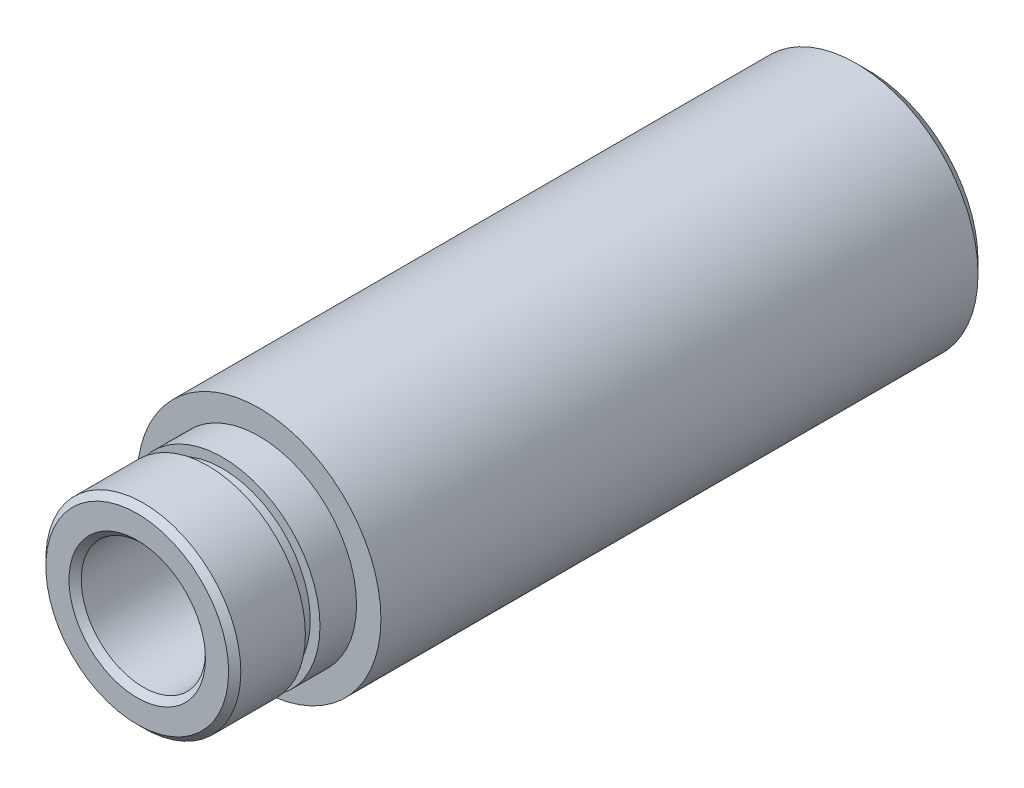
ISO-10303-21;
HEADER;
FILE_DESCRIPTION(('STEP AP214'),'2;1');
FILE_NAME('part.step','',(''),(''),'','','');
FILE_SCHEMA(('AUTOMOTIVE_DESIGN { 1 0 10303 214 1 1 1 1 }'));
ENDSEC;
DATA;
#1=APPLICATION_CONTEXT('core data for automotive mechanical design processes');
#2=APPLICATION_PROTOCOL_DEFINITION('international standard','automotive_design',2000,#1);
#3=PRODUCT_CONTEXT('',#1,'mechanical');
#4=PRODUCT('Part','Part','',(#3));
#5=PRODUCT_RELATED_PRODUCT_CATEGORY('part','',(#4));
#6=PRODUCT_DEFINITION_FORMATION('','',#4);
#7=PRODUCT_DEFINITION_CONTEXT('part definition',#1,'design');
#8=PRODUCT_DEFINITION('design','',#6,#7);
#9=PRODUCT_DEFINITION_SHAPE('','',#8);
#10=(LENGTH_UNIT() NAMED_UNIT(*) SI_UNIT(.MILLI.,.METRE.));
#11=(NAMED_UNIT(*) PLANE_ANGLE_UNIT() SI_UNIT($,.RADIAN.));
#12=(NAMED_UNIT(*) SI_UNIT($,.STERADIAN.) SOLID_ANGLE_UNIT());
#13=UNCERTAINTY_MEASURE_WITH_UNIT(LENGTH_MEASURE(1.E-05),#10,'distance_accuracy_value','');
#14=(GEOMETRIC_REPRESENTATION_CONTEXT(3) GLOBAL_UNCERTAINTY_ASSIGNED_CONTEXT((#13)) GLOBAL_UNIT_ASSIGNED_CONTEXT((#10,
#11,#12)) REPRESENTATION_CONTEXT('',''));
#15=CARTESIAN_POINT('',(0.,0.,0.));
#16=DIRECTION('',(0.,0.,1.));
#17=DIRECTION('',(1.,0.,0.));
#18=AXIS2_PLACEMENT_3D('',#15,#16,#17);
#19=CARTESIAN_POINT('',(0.,0.,20.));
#20=DIRECTION('',(0.,0.,1.));
#21=DIRECTION('',(1.,0.,0.));
#22=AXIS2_PLACEMENT_3D('',#19,#20,#21);
#23=CYLINDRICAL_SURFACE('',#22,8.);
#24=CARTESIAN_POINT('',(0.,0.,29.5));
#25=DIRECTION('',(0.,0.,1.));
#26=DIRECTION('',(1.,0.,0.));
#27=AXIS2_PLACEMENT_3D('',#24,#25,#26);
#28=CIRCLE('',#27,8.);
#29=CARTESIAN_POINT('',(8.,0.,29.5));
#30=VERTEX_POINT('',#29);
#31=EDGE_CURVE('E57',#30,#30,#28,.F.);
#32=ORIENTED_EDGE('',*,*,#31,.T.);
#33=EDGE_LOOP('',(#32));
#34=FACE_BOUND('',#33,.T.);
#35=CARTESIAN_POINT('',(0.,0.,24.2));
#36=DIRECTION('',(0.,0.,-1.));
#37=DIRECTION('',(-1.,0.,0.));
#38=AXIS2_PLACEMENT_3D('',#35,#36,#37);
#39=CIRCLE('',#38,8.);
#40=CARTESIAN_POINT('',(-8.,0.,24.2));
#41=VERTEX_POINT('',#40);
#42=EDGE_CURVE('E64',#41,#41,#39,.F.);
#43=ORIENTED_EDGE('',*,*,#42,.T.);
#44=EDGE_LOOP('',(#43));
#45=FACE_BOUND('',#44,.T.);
#46=ADVANCED_FACE('F46',(#34,#45),#23,.T.);
#47=CARTESIAN_POINT('',(0.,0.,20.));
#48=DIRECTION('',(0.,0.,1.));
#49=DIRECTION('',(1.,0.,0.));
#50=AXIS2_PLACEMENT_3D('',#47,#48,#49);
#51=CIRCLE('',#50,8.);
#52=CARTESIAN_POINT('',(8.,0.,20.));
#53=VERTEX_POINT('',#52);
#54=EDGE_CURVE('E67',#53,#53,#51,.T.);
#55=ORIENTED_EDGE('',*,*,#54,.T.);
#56=EDGE_LOOP('',(#55));
#57=FACE_BOUND('',#56,.T.);
#58=CARTESIAN_POINT('',(0.,0.,23.));
#59=DIRECTION('',(0.,0.,1.));
#60=DIRECTION('',(1.,0.,0.));
#61=AXIS2_PLACEMENT_3D('',#58,#59,#60);
#62=CIRCLE('',#61,8.);
#63=CARTESIAN_POINT('',(8.,0.,23.));
#64=VERTEX_POINT('',#63);
#65=EDGE_CURVE('E68',#64,#64,#62,.F.);
#66=ORIENTED_EDGE('',*,*,#65,.T.);
#67=EDGE_LOOP('',(#66));
#68=FACE_BOUND('',#67,.T.);
#69=ADVANCED_FACE('F114',(#57,#68),#23,.T.);
#70=CARTESIAN_POINT('',(0.,0.,30.));
#71=DIRECTION('',(0.,0.,1.));
#72=DIRECTION('',(1.,0.,0.));
#73=AXIS2_PLACEMENT_3D('',#70,#71,#72);
#74=PLANE('',#73);
#75=CARTESIAN_POINT('',(0.,0.,30.));
#76=DIRECTION('',(0.,0.,1.));
#77=DIRECTION('',(1.,0.,0.));
#78=AXIS2_PLACEMENT_3D('',#75,#76,#77);
#79=CIRCLE('',#78,5.60000000000001);
#80=CARTESIAN_POINT('',(5.60000000000001,0.,30.));
#81=VERTEX_POINT('',#80);
#82=EDGE_CURVE('E61',#81,#81,#79,.F.);
#83=ORIENTED_EDGE('',*,*,#82,.T.);
#84=EDGE_LOOP('',(#83));
#85=FACE_BOUND('',#84,.T.);
#86=CARTESIAN_POINT('',(0.,0.,30.));
#87=DIRECTION('',(0.,0.,1.));
#88=DIRECTION('',(1.,0.,0.));
#89=AXIS2_PLACEMENT_3D('',#86,#87,#88);
#90=CIRCLE('',#89,7.50000000000001);
#91=CARTESIAN_POINT('',(7.50000000000001,0.,30.));
#92=VERTEX_POINT('',#91);
#93=EDGE_CURVE('E74',#92,#92,#90,.T.);
#94=ORIENTED_EDGE('',*,*,#93,.T.);
#95=EDGE_LOOP('',(#94));
#96=FACE_BOUND('',#95,.T.);
#97=ADVANCED_FACE('F120',(#85,#96),#74,.T.);
#98=CARTESIAN_POINT('',(0.,0.,30.));
#99=DIRECTION('',(0.,0.,-1.));
#100=DIRECTION('',(-1.,0.,0.));
#101=AXIS2_PLACEMENT_3D('',#98,#99,#100);
#102=CYLINDRICAL_SURFACE('',#101,10.);
#103=CARTESIAN_POINT('',(0.,0.,-29.));
#104=DIRECTION('',(0.,0.,1.));
#105=DIRECTION('',(1.,0.,0.));
#106=AXIS2_PLACEMENT_3D('',#103,#104,#105);
#107=CIRCLE('',#106,10.);
#108=CARTESIAN_POINT('',(10.,0.,-29.));
#109=VERTEX_POINT('',#108);
#110=EDGE_CURVE('E53',#109,#109,#107,.T.);
#111=ORIENTED_EDGE('',*,*,#110,.T.);
#112=EDGE_LOOP('',(#111));
#113=FACE_BOUND('',#112,.T.);
#114=CARTESIAN_POINT('',(0.,0.,20.));
#115=DIRECTION('',(0.,0.,1.));
#116=DIRECTION('',(1.,0.,0.));
#117=AXIS2_PLACEMENT_3D('',#114,#115,#116);
#118=CIRCLE('',#117,10.);
#119=CARTESIAN_POINT('',(10.,0.,20.));
#120=VERTEX_POINT('',#119);
#121=EDGE_CURVE('E86',#120,#120,#118,.T.);
#122=ORIENTED_EDGE('',*,*,#121,.F.);
#123=EDGE_LOOP('',(#122));
#124=FACE_BOUND('',#123,.T.);
#125=ADVANCED_FACE('F136',(#113,#124),#102,.T.);
#126=CARTESIAN_POINT('',(0.,0.,-30.));
#127=DIRECTION('',(0.,0.,1.));
#128=DIRECTION('',(1.,0.,0.));
#129=AXIS2_PLACEMENT_3D('',#126,#127,#128);
#130=PLANE('',#129);
#131=CARTESIAN_POINT('',(0.,0.,-30.));
#132=DIRECTION('',(0.,0.,1.));
#133=DIRECTION('',(1.,0.,0.));
#134=AXIS2_PLACEMENT_3D('',#131,#132,#133);
#135=CIRCLE('',#134,8.99999999999999);
#136=CARTESIAN_POINT('',(8.99999999999999,0.,-30.));
#137=VERTEX_POINT('',#136);
#138=EDGE_CURVE('E13',#137,#137,#135,.F.);
#139=ORIENTED_EDGE('',*,*,#138,.T.);
#140=EDGE_LOOP('',(#139));
#141=FACE_BOUND('',#140,.T.);
#142=CARTESIAN_POINT('',(0.,0.,-30.));
#143=DIRECTION('',(0.,0.,1.));
#144=DIRECTION('',(1.,0.,0.));
#145=AXIS2_PLACEMENT_3D('',#142,#143,#144);
#146=CIRCLE('',#145,5.59999999999999);
#147=CARTESIAN_POINT('',(5.59999999999999,0.,-30.));
#148=VERTEX_POINT('',#147);
#149=EDGE_CURVE('E83',#148,#148,#146,.T.);
#150=ORIENTED_EDGE('',*,*,#149,.T.);
#151=EDGE_LOOP('',(#150));
#152=FACE_BOUND('',#151,.T.);
#153=ADVANCED_FACE('F132',(#141,#152),#130,.F.);
#154=CARTESIAN_POINT('',(0.,0.,30.));
#155=DIRECTION('',(0.,0.,-1.));
#156=DIRECTION('',(-1.,0.,0.));
#157=AXIS2_PLACEMENT_3D('',#154,#155,#156);
#158=CYLINDRICAL_SURFACE('',#157,5.1);
#159=CARTESIAN_POINT('',(0.,0.,-29.5));
#160=DIRECTION('',(0.,0.,1.));
#161=DIRECTION('',(1.,0.,0.));
#162=AXIS2_PLACEMENT_3D('',#159,#160,#161);
#163=CIRCLE('',#162,5.1);
#164=CARTESIAN_POINT('',(5.1,0.,-29.5));
#165=VERTEX_POINT('',#164);
#166=EDGE_CURVE('E77',#165,#165,#163,.F.);
#167=ORIENTED_EDGE('',*,*,#166,.T.);
#168=EDGE_LOOP('',(#167));
#169=FACE_BOUND('',#168,.T.);
#170=CARTESIAN_POINT('',(0.,0.,29.5));
#171=DIRECTION('',(0.,0.,1.));
#172=DIRECTION('',(1.,0.,0.));
#173=AXIS2_PLACEMENT_3D('',#170,#171,#172);
#174=CIRCLE('',#173,5.1);
#175=CARTESIAN_POINT('',(5.1,0.,29.5));
#176=VERTEX_POINT('',#175);
#177=EDGE_CURVE('E80',#176,#176,#174,.T.);
#178=ORIENTED_EDGE('',*,*,#177,.T.);
#179=EDGE_LOOP('',(#178));
#180=FACE_BOUND('',#179,.T.);
#181=ADVANCED_FACE('F128',(#169,#180),#158,.F.);
#182=CARTESIAN_POINT('',(0.,0.,20.));
#183=DIRECTION('',(0.,0.,1.));
#184=DIRECTION('',(1.,0.,0.));
#185=AXIS2_PLACEMENT_3D('',#182,#183,#184);
#186=PLANE('',#185);
#187=ORIENTED_EDGE('',*,*,#54,.F.);
#188=EDGE_LOOP('',(#187));
#189=FACE_BOUND('',#188,.T.);
#190=ORIENTED_EDGE('',*,*,#121,.T.);
#191=EDGE_LOOP('',(#190));
#192=FACE_BOUND('',#191,.T.);
#193=ADVANCED_FACE('F124',(#189,#192),#186,.T.);
#194=CARTESIAN_POINT('',(0.,0.,-30.));
#195=DIRECTION('',(0.,0.,-1.));
#196=DIRECTION('',(-1.,0.,0.));
#197=AXIS2_PLACEMENT_3D('',#194,#195,#196);
#198=CONICAL_SURFACE('',#197,5.59999999999999,0.785398163397449);
#199=ORIENTED_EDGE('',*,*,#166,.F.);
#200=EDGE_LOOP('',(#199));
#201=FACE_BOUND('',#200,.T.);
#202=ORIENTED_EDGE('',*,*,#149,.F.);
#203=EDGE_LOOP('',(#202));
#204=FACE_BOUND('',#203,.T.);
#205=ADVANCED_FACE('F127',(#201,#204),#198,.F.);
#206=CARTESIAN_POINT('',(0.,0.,29.5));
#207=DIRECTION('',(0.,0.,1.));
#208=DIRECTION('',(1.,0.,0.));
#209=AXIS2_PLACEMENT_3D('',#206,#207,#208);
#210=CONICAL_SURFACE('',#209,5.1,0.785398163397456);
#211=ORIENTED_EDGE('',*,*,#82,.F.);
#212=EDGE_LOOP('',(#211));
#213=FACE_BOUND('',#212,.T.);
#214=ORIENTED_EDGE('',*,*,#177,.F.);
#215=EDGE_LOOP('',(#214));
#216=FACE_BOUND('',#215,.T.);
#217=ADVANCED_FACE('F144',(#213,#216),#210,.F.);
#218=CARTESIAN_POINT('',(0.,0.,30.));
#219=DIRECTION('',(0.,0.,-1.));
#220=DIRECTION('',(-1.,0.,0.));
#221=AXIS2_PLACEMENT_3D('',#218,#219,#220);
#222=CONICAL_SURFACE('',#221,7.50000000000001,0.785398163397441);
#223=ORIENTED_EDGE('',*,*,#31,.F.);
#224=EDGE_LOOP('',(#223));
#225=FACE_BOUND('',#224,.T.);
#226=ORIENTED_EDGE('',*,*,#93,.F.);
#227=EDGE_LOOP('',(#226));
#228=FACE_BOUND('',#227,.T.);
#229=ADVANCED_FACE('F110',(#225,#228),#222,.T.);
#230=CARTESIAN_POINT('',(13.2,0.,24.2));
#231=DIRECTION('',(0.,0.,-1.));
#232=DIRECTION('',(-1.,0.,0.));
#233=AXIS2_PLACEMENT_3D('',#230,#231,#232);
#234=PLANE('',#233);
#235=ORIENTED_EDGE('',*,*,#42,.F.);
#236=EDGE_LOOP('',(#235));
#237=FACE_BOUND('',#236,.T.);
#238=CARTESIAN_POINT('',(0.,0.,24.2));
#239=DIRECTION('',(0.,0.,-1.));
#240=DIRECTION('',(-1.,0.,0.));
#241=AXIS2_PLACEMENT_3D('',#238,#239,#240);
#242=CIRCLE('',#241,7.2);
#243=CARTESIAN_POINT('',(-7.2,0.,24.2));
#244=VERTEX_POINT('',#243);
#245=EDGE_CURVE('E70',#244,#244,#242,.T.);
#246=ORIENTED_EDGE('',*,*,#245,.F.);
#247=EDGE_LOOP('',(#246));
#248=FACE_BOUND('',#247,.T.);
#249=ADVANCED_FACE('F101',(#237,#248),#234,.T.);
#250=CARTESIAN_POINT('',(0.,0.,0.));
#251=DIRECTION('',(0.,0.,-1.));
#252=DIRECTION('',(-1.,0.,0.));
#253=AXIS2_PLACEMENT_3D('',#250,#251,#252);
#254=CYLINDRICAL_SURFACE('',#253,7.2);
#255=ORIENTED_EDGE('',*,*,#245,.T.);
#256=EDGE_LOOP('',(#255));
#257=FACE_BOUND('',#256,.T.);
#258=CARTESIAN_POINT('',(0.,0.,23.));
#259=DIRECTION('',(0.,0.,-1.));
#260=DIRECTION('',(-1.,0.,0.));
#261=AXIS2_PLACEMENT_3D('',#258,#259,#260);
#262=CIRCLE('',#261,7.2);
#263=CARTESIAN_POINT('',(-7.2,0.,23.));
#264=VERTEX_POINT('',#263);
#265=EDGE_CURVE('E93',#264,#264,#262,.T.);
#266=ORIENTED_EDGE('',*,*,#265,.F.);
#267=EDGE_LOOP('',(#266));
#268=FACE_BOUND('',#267,.T.);
#269=ADVANCED_FACE('F99',(#257,#268),#254,.T.);
#270=CARTESIAN_POINT('',(13.2,0.,23.));
#271=DIRECTION('',(0.,0.,1.));
#272=DIRECTION('',(1.,0.,0.));
#273=AXIS2_PLACEMENT_3D('',#270,#271,#272);
#274=PLANE('',#273);
#275=ORIENTED_EDGE('',*,*,#65,.F.);
#276=EDGE_LOOP('',(#275));
#277=FACE_BOUND('',#276,.T.);
#278=ORIENTED_EDGE('',*,*,#265,.T.);
#279=EDGE_LOOP('',(#278));
#280=FACE_BOUND('',#279,.T.);
#281=ADVANCED_FACE('F97',(#277,#280),#274,.T.);
#282=CARTESIAN_POINT('',(0.,0.,-29.));
#283=DIRECTION('',(0.,0.,1.));
#284=DIRECTION('',(1.,0.,0.));
#285=AXIS2_PLACEMENT_3D('',#282,#283,#284);
#286=CONICAL_SURFACE('',#285,10.,0.785398163397452);
#287=ORIENTED_EDGE('',*,*,#138,.F.);
#288=EDGE_LOOP('',(#287));
#289=FACE_BOUND('',#288,.T.);
#290=ORIENTED_EDGE('',*,*,#110,.F.);
#291=EDGE_LOOP('',(#290));
#292=FACE_BOUND('',#291,.T.);
#293=ADVANCED_FACE('F48',(#289,#292),#286,.T.);
#294=CLOSED_SHELL('',(#46,#69,#97,#125,#153,#181,#193,#205,#217,#229,#249,#269,#281,#293));
#295=MANIFOLD_SOLID_BREP('B2',#294);
#296=ADVANCED_BREP_SHAPE_REPRESENTATION('',(#18,#295),#14);
#297=SHAPE_DEFINITION_REPRESENTATION(#9,#296);
ENDSEC;
END-ISO-10303-21;
